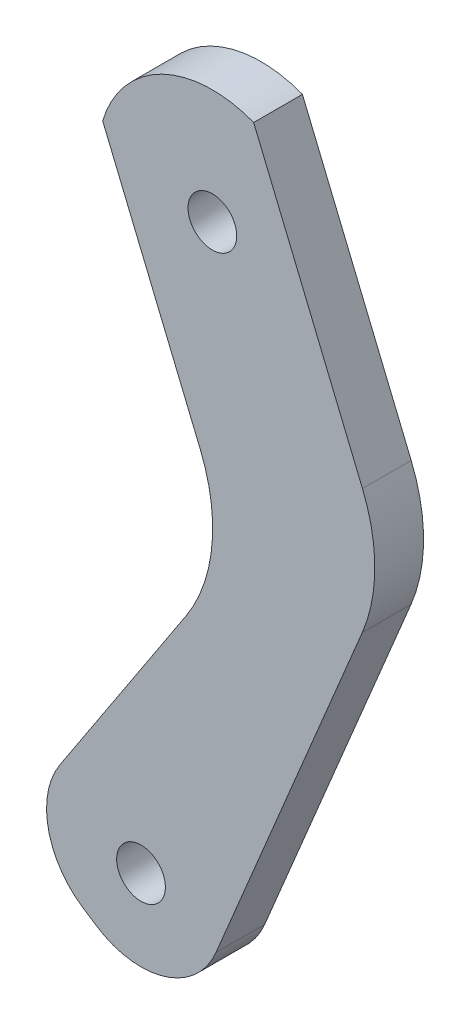
ISO-10303-21;
HEADER;
FILE_DESCRIPTION(('STEP AP214'),'2;1');
FILE_NAME('part.step','',(''),(''),'','','');
FILE_SCHEMA(('AUTOMOTIVE_DESIGN { 1 0 10303 214 1 1 1 1 }'));
ENDSEC;
DATA;
#1=APPLICATION_CONTEXT('core data for automotive mechanical design processes');
#2=APPLICATION_PROTOCOL_DEFINITION('international standard','automotive_design',2000,#1);
#3=PRODUCT_CONTEXT('',#1,'mechanical');
#4=PRODUCT('Part','Part','',(#3));
#5=PRODUCT_RELATED_PRODUCT_CATEGORY('part','',(#4));
#6=PRODUCT_DEFINITION_FORMATION('','',#4);
#7=PRODUCT_DEFINITION_CONTEXT('part definition',#1,'design');
#8=PRODUCT_DEFINITION('design','',#6,#7);
#9=PRODUCT_DEFINITION_SHAPE('','',#8);
#10=(LENGTH_UNIT() NAMED_UNIT(*) SI_UNIT(.MILLI.,.METRE.));
#11=(NAMED_UNIT(*) PLANE_ANGLE_UNIT() SI_UNIT($,.RADIAN.));
#12=(NAMED_UNIT(*) SI_UNIT($,.STERADIAN.) SOLID_ANGLE_UNIT());
#13=UNCERTAINTY_MEASURE_WITH_UNIT(LENGTH_MEASURE(1.E-05),#10,'distance_accuracy_value','');
#14=(GEOMETRIC_REPRESENTATION_CONTEXT(3) GLOBAL_UNCERTAINTY_ASSIGNED_CONTEXT((#13)) GLOBAL_UNIT_ASSIGNED_CONTEXT((#10,
#11,#12)) REPRESENTATION_CONTEXT('',''));
#15=CARTESIAN_POINT('',(0.,0.,0.));
#16=DIRECTION('',(0.,0.,1.));
#17=DIRECTION('',(1.,0.,0.));
#18=AXIS2_PLACEMENT_3D('',#15,#16,#17);
#19=CARTESIAN_POINT('',(0.,0.,30.));
#20=DIRECTION('',(0.,0.,1.));
#21=DIRECTION('',(1.,0.,0.));
#22=AXIS2_PLACEMENT_3D('',#19,#20,#21);
#23=PLANE('',#22);
#24=CARTESIAN_POINT('',(12.5109227187413,-76.9287521555556,30.));
#25=DIRECTION('',(0.,0.,1.));
#26=DIRECTION('',(1.,0.,0.));
#27=AXIS2_PLACEMENT_3D('',#24,#25,#26);
#28=CIRCLE('',#27,1.5);
#29=CARTESIAN_POINT('',(14.0109227187413,-76.9287521555556,30.));
#30=VERTEX_POINT('',#29);
#31=EDGE_CURVE('E166',#30,#30,#28,.T.);
#32=ORIENTED_EDGE('',*,*,#31,.F.);
#33=EDGE_LOOP('',(#32));
#34=FACE_BOUND('',#33,.T.);
#35=CARTESIAN_POINT('',(16.903408741352,-40.0174940368885,30.));
#36=DIRECTION('',(0.,0.,1.));
#37=DIRECTION('',(1.,0.,0.));
#38=AXIS2_PLACEMENT_3D('',#35,#36,#37);
#39=CIRCLE('',#38,1.5);
#40=CARTESIAN_POINT('',(18.403408741352,-40.0174940368885,30.));
#41=VERTEX_POINT('',#40);
#42=EDGE_CURVE('E162',#41,#41,#39,.T.);
#43=ORIENTED_EDGE('',*,*,#42,.F.);
#44=EDGE_LOOP('',(#43));
#45=FACE_BOUND('',#44,.T.);
#46=DIRECTION('',(0.382683432365094,-0.923879532511285,0.));
#47=VECTOR('',#46,1.);
#48=CARTESIAN_POINT('',(4.77297077300924,1.97702922699085,30.));
#49=LINE('',#48,#47);
#50=CARTESIAN_POINT('',(19.4456283635584,-33.445899724169,30.));
#51=VERTEX_POINT('',#50);
#52=CARTESIAN_POINT('',(26.1422040664648,-49.6128636075837,30.));
#53=VERTEX_POINT('',#52);
#54=EDGE_CURVE('E139',#51,#53,#49,.T.);
#55=ORIENTED_EDGE('',*,*,#54,.F.);
#56=CARTESIAN_POINT('',(16.903408741352,-40.0174940368885,30.));
#57=DIRECTION('',(0.,0.,1.));
#58=DIRECTION('',(1.,0.,0.));
#59=AXIS2_PLACEMENT_3D('',#56,#57,#58);
#60=CIRCLE('',#59,7.04618566449239);
#61=CARTESIAN_POINT('',(10.1505545040191,-38.0056063492099,30.));
#62=VERTEX_POINT('',#61);
#63=EDGE_CURVE('E55',#51,#62,#60,.T.);
#64=ORIENTED_EDGE('',*,*,#63,.T.);
#65=DIRECTION('',(0.382683432365094,-0.923879532511285,0.));
#66=VECTOR('',#65,1.);
#67=CARTESIAN_POINT('',(-4.77297077300924,-1.97702922699085,30.));
#68=LINE('',#67,#66);
#69=CARTESIAN_POINT('',(16.1615566872011,-52.5174493433021,30.));
#70=VERTEX_POINT('',#69);
#71=EDGE_CURVE('E196',#62,#70,#68,.T.);
#72=ORIENTED_EDGE('',*,*,#71,.T.);
#73=CARTESIAN_POINT('',(6.92276136208832,-56.3442836669531,30.));
#74=DIRECTION('',(0.,0.,1.));
#75=DIRECTION('',(1.,0.,0.));
#76=AXIS2_PLACEMENT_3D('',#73,#74,#75);
#77=CIRCLE('',#76,10.);
#78=CARTESIAN_POINT('',(15.280220873497,-61.8354466143773,30.));
#79=VERTEX_POINT('',#78);
#80=EDGE_CURVE('E199',#70,#79,#77,.F.);
#81=ORIENTED_EDGE('',*,*,#80,.T.);
#82=DIRECTION('',(-0.549116294742421,-0.835745951140868,0.));
#83=VECTOR('',#82,1.);
#84=CARTESIAN_POINT('',(39.0504251785727,-25.6575873959091,30.));
#85=LINE('',#84,#83);
#86=CARTESIAN_POINT('',(7.5185522467214,-73.6485783517402,30.));
#87=VERTEX_POINT('',#86);
#88=EDGE_CURVE('E171',#79,#87,#85,.T.);
#89=ORIENTED_EDGE('',*,*,#88,.T.);
#90=CARTESIAN_POINT('',(11.6972820024257,-76.3941598254523,30.));
#91=DIRECTION('',(0.,0.,1.));
#92=DIRECTION('',(1.,0.,0.));
#93=AXIS2_PLACEMENT_3D('',#90,#91,#92);
#94=CIRCLE('',#93,4.99999999999997);
#95=CARTESIAN_POINT('',(8.95170052871361,-80.5728895811567,30.));
#96=VERTEX_POINT('',#95);
#97=EDGE_CURVE('E175',#87,#96,#94,.T.);
#98=ORIENTED_EDGE('',*,*,#97,.T.);
#99=DIRECTION('',(0.835745951140868,-0.549116294742421,0.));
#100=VECTOR('',#99,1.);
#101=CARTESIAN_POINT('',(-34.2774544055634,-52.1697207115355,30.));
#102=LINE('',#101,#100);
#103=CARTESIAN_POINT('',(9.76534124502913,-81.1074819112599,30.));
#104=VERTEX_POINT('',#103);
#105=EDGE_CURVE('E179',#96,#104,#102,.T.);
#106=ORIENTED_EDGE('',*,*,#105,.T.);
#107=CARTESIAN_POINT('',(12.5109227187413,-76.9287521555556,30.));
#108=DIRECTION('',(0.,0.,1.));
#109=DIRECTION('',(1.,0.,0.));
#110=AXIS2_PLACEMENT_3D('',#107,#108,#109);
#111=CIRCLE('',#110,5.);
#112=CARTESIAN_POINT('',(17.1246309080053,-78.8558475720615,30.));
#113=VERTEX_POINT('',#112);
#114=EDGE_CURVE('E183',#104,#113,#111,.T.);
#115=ORIENTED_EDGE('',*,*,#114,.T.);
#116=DIRECTION('',(-0.385419083301175,-0.922741637852808,0.));
#117=VECTOR('',#116,1.);
#118=CARTESIAN_POINT('',(42.6252734327728,-17.8041102059186,30.));
#119=LINE('',#118,#117);
#120=CARTESIAN_POINT('',(26.1308251198801,-57.2938887642465,30.));
#121=VERTEX_POINT('',#120);
#122=EDGE_CURVE('E187',#121,#113,#119,.T.);
#123=ORIENTED_EDGE('',*,*,#122,.F.);
#124=CARTESIAN_POINT('',(16.903408741352,-53.4396979312347,30.));
#125=DIRECTION('',(0.,0.,1.));
#126=DIRECTION('',(1.,0.,0.));
#127=AXIS2_PLACEMENT_3D('',#124,#125,#126);
#128=CIRCLE('',#127,10.);
#129=EDGE_CURVE('E191',#121,#53,#128,.T.);
#130=ORIENTED_EDGE('',*,*,#129,.T.);
#131=EDGE_LOOP('',(#55,#64,#72,#81,#89,#98,#106,#115,#123,#130));
#132=FACE_BOUND('',#131,.T.);
#133=ADVANCED_FACE('F41',(#34,#45,#132),#23,.T.);
#134=CARTESIAN_POINT('',(-17.7714547427025,-30.,27.));
#135=DIRECTION('',(0.,0.,1.));
#136=DIRECTION('',(1.,0.,0.));
#137=AXIS2_PLACEMENT_3D('',#134,#135,#136);
#138=PLANE('',#137);
#139=CARTESIAN_POINT('',(12.5109227187413,-76.9287521555556,27.));
#140=DIRECTION('',(0.,0.,1.));
#141=DIRECTION('',(1.,0.,0.));
#142=AXIS2_PLACEMENT_3D('',#139,#140,#141);
#143=CIRCLE('',#142,1.5);
#144=CARTESIAN_POINT('',(14.0109227187413,-76.9287521555556,27.));
#145=VERTEX_POINT('',#144);
#146=EDGE_CURVE('E233',#145,#145,#143,.T.);
#147=ORIENTED_EDGE('',*,*,#146,.T.);
#148=EDGE_LOOP('',(#147));
#149=FACE_BOUND('',#148,.T.);
#150=CARTESIAN_POINT('',(16.903408741352,-40.0174940368885,27.));
#151=DIRECTION('',(0.,0.,1.));
#152=DIRECTION('',(1.,0.,0.));
#153=AXIS2_PLACEMENT_3D('',#150,#151,#152);
#154=CIRCLE('',#153,1.5);
#155=CARTESIAN_POINT('',(18.403408741352,-40.0174940368885,27.));
#156=VERTEX_POINT('',#155);
#157=EDGE_CURVE('E203',#156,#156,#154,.T.);
#158=ORIENTED_EDGE('',*,*,#157,.T.);
#159=EDGE_LOOP('',(#158));
#160=FACE_BOUND('',#159,.T.);
#161=CARTESIAN_POINT('',(16.903408741352,-40.0174940368885,27.));
#162=DIRECTION('',(0.,0.,1.));
#163=DIRECTION('',(1.,0.,0.));
#164=AXIS2_PLACEMENT_3D('',#161,#162,#163);
#165=CIRCLE('',#164,7.04618566449239);
#166=CARTESIAN_POINT('',(19.4456283635584,-33.445899724169,27.));
#167=VERTEX_POINT('',#166);
#168=CARTESIAN_POINT('',(10.1505545040191,-38.0056063492099,27.));
#169=VERTEX_POINT('',#168);
#170=EDGE_CURVE('E130',#167,#169,#165,.T.);
#171=ORIENTED_EDGE('',*,*,#170,.F.);
#172=DIRECTION('',(0.382683432365094,-0.923879532511285,0.));
#173=VECTOR('',#172,1.);
#174=CARTESIAN_POINT('',(4.77297077300924,1.97702922699085,27.));
#175=LINE('',#174,#173);
#176=CARTESIAN_POINT('',(26.1422040664648,-49.6128636075837,27.));
#177=VERTEX_POINT('',#176);
#178=EDGE_CURVE('E122',#167,#177,#175,.T.);
#179=ORIENTED_EDGE('',*,*,#178,.T.);
#180=CARTESIAN_POINT('',(16.903408741352,-53.4396979312347,27.));
#181=DIRECTION('',(0.,0.,1.));
#182=DIRECTION('',(1.,0.,0.));
#183=AXIS2_PLACEMENT_3D('',#180,#181,#182);
#184=CIRCLE('',#183,10.);
#185=CARTESIAN_POINT('',(26.1308251198801,-57.2938887642465,27.));
#186=VERTEX_POINT('',#185);
#187=EDGE_CURVE('E126',#186,#177,#184,.T.);
#188=ORIENTED_EDGE('',*,*,#187,.F.);
#189=DIRECTION('',(-0.385419083301175,-0.922741637852808,0.));
#190=VECTOR('',#189,1.);
#191=CARTESIAN_POINT('',(42.6252734327728,-17.8041102059186,27.));
#192=LINE('',#191,#190);
#193=CARTESIAN_POINT('',(17.1246309080053,-78.8558475720615,27.));
#194=VERTEX_POINT('',#193);
#195=EDGE_CURVE('E150',#186,#194,#192,.T.);
#196=ORIENTED_EDGE('',*,*,#195,.T.);
#197=CARTESIAN_POINT('',(12.5109227187413,-76.9287521555556,27.));
#198=DIRECTION('',(0.,0.,1.));
#199=DIRECTION('',(1.,0.,0.));
#200=AXIS2_PLACEMENT_3D('',#197,#198,#199);
#201=CIRCLE('',#200,5.);
#202=CARTESIAN_POINT('',(9.76534124502913,-81.1074819112599,27.));
#203=VERTEX_POINT('',#202);
#204=EDGE_CURVE('E153',#203,#194,#201,.T.);
#205=ORIENTED_EDGE('',*,*,#204,.F.);
#206=DIRECTION('',(0.835745951140868,-0.549116294742421,0.));
#207=VECTOR('',#206,1.);
#208=CARTESIAN_POINT('',(-34.2774544055634,-52.1697207115355,27.));
#209=LINE('',#208,#207);
#210=CARTESIAN_POINT('',(8.95170052871361,-80.5728895811567,27.));
#211=VERTEX_POINT('',#210);
#212=EDGE_CURVE('E237',#211,#203,#209,.T.);
#213=ORIENTED_EDGE('',*,*,#212,.F.);
#214=CARTESIAN_POINT('',(11.6972820024257,-76.3941598254523,27.));
#215=DIRECTION('',(0.,0.,1.));
#216=DIRECTION('',(1.,0.,0.));
#217=AXIS2_PLACEMENT_3D('',#214,#215,#216);
#218=CIRCLE('',#217,4.99999999999997);
#219=CARTESIAN_POINT('',(7.5185522467214,-73.6485783517402,27.));
#220=VERTEX_POINT('',#219);
#221=EDGE_CURVE('E231',#220,#211,#218,.T.);
#222=ORIENTED_EDGE('',*,*,#221,.F.);
#223=DIRECTION('',(-0.549116294742421,-0.835745951140868,0.));
#224=VECTOR('',#223,1.);
#225=CARTESIAN_POINT('',(39.0504251785727,-25.6575873959091,27.));
#226=LINE('',#225,#224);
#227=CARTESIAN_POINT('',(15.280220873497,-61.8354466143773,27.));
#228=VERTEX_POINT('',#227);
#229=EDGE_CURVE('E221',#228,#220,#226,.T.);
#230=ORIENTED_EDGE('',*,*,#229,.F.);
#231=CARTESIAN_POINT('',(6.92276136208832,-56.3442836669531,27.));
#232=DIRECTION('',(0.,0.,1.));
#233=DIRECTION('',(1.,0.,0.));
#234=AXIS2_PLACEMENT_3D('',#231,#232,#233);
#235=CIRCLE('',#234,10.);
#236=CARTESIAN_POINT('',(16.1615566872011,-52.5174493433021,27.));
#237=VERTEX_POINT('',#236);
#238=EDGE_CURVE('E159',#237,#228,#235,.F.);
#239=ORIENTED_EDGE('',*,*,#238,.F.);
#240=DIRECTION('',(0.382683432365094,-0.923879532511285,0.));
#241=VECTOR('',#240,1.);
#242=CARTESIAN_POINT('',(-4.77297077300924,-1.97702922699085,27.));
#243=LINE('',#242,#241);
#244=EDGE_CURVE('E133',#169,#237,#243,.T.);
#245=ORIENTED_EDGE('',*,*,#244,.F.);
#246=EDGE_LOOP('',(#171,#179,#188,#196,#205,#213,#222,#230,#239,#245));
#247=FACE_BOUND('',#246,.T.);
#248=ADVANCED_FACE('F124',(#149,#160,#247),#138,.F.);
#249=CARTESIAN_POINT('',(-4.77297077300924,-1.97702922699085,27.));
#250=DIRECTION('',(-0.923879532511285,-0.382683432365094,0.));
#251=DIRECTION('',(0.382683432365094,-0.923879532511285,0.));
#252=AXIS2_PLACEMENT_3D('',#249,#250,#251);
#253=PLANE('',#252);
#254=ORIENTED_EDGE('',*,*,#71,.F.);
#255=DIRECTION('',(0.,0.,1.));
#256=VECTOR('',#255,1.);
#257=CARTESIAN_POINT('',(10.1505545040191,-38.0056063492099,27.));
#258=LINE('',#257,#256);
#259=EDGE_CURVE('E167',#62,#169,#258,.F.);
#260=ORIENTED_EDGE('',*,*,#259,.T.);
#261=ORIENTED_EDGE('',*,*,#244,.T.);
#262=DIRECTION('',(0.,0.,1.));
#263=VECTOR('',#262,1.);
#264=CARTESIAN_POINT('',(16.1615566872011,-52.5174493433021,27.));
#265=LINE('',#264,#263);
#266=EDGE_CURVE('E144',#237,#70,#265,.T.);
#267=ORIENTED_EDGE('',*,*,#266,.T.);
#268=EDGE_LOOP('',(#254,#260,#261,#267));
#269=FACE_BOUND('',#268,.T.);
#270=ADVANCED_FACE('F271',(#269),#253,.T.);
#271=CARTESIAN_POINT('',(4.77297077300924,1.97702922699085,27.));
#272=DIRECTION('',(-0.923879532511285,-0.382683432365094,0.));
#273=DIRECTION('',(0.382683432365094,-0.923879532511285,0.));
#274=AXIS2_PLACEMENT_3D('',#271,#272,#273);
#275=PLANE('',#274);
#276=DIRECTION('',(0.,0.,1.));
#277=VECTOR('',#276,1.);
#278=CARTESIAN_POINT('',(19.4456283635584,-33.445899724169,27.));
#279=LINE('',#278,#277);
#280=EDGE_CURVE('E11',#51,#167,#279,.F.);
#281=ORIENTED_EDGE('',*,*,#280,.F.);
#282=ORIENTED_EDGE('',*,*,#54,.T.);
#283=DIRECTION('',(0.,0.,1.));
#284=VECTOR('',#283,1.);
#285=CARTESIAN_POINT('',(26.1422040664648,-49.6128636075837,27.));
#286=LINE('',#285,#284);
#287=EDGE_CURVE('E136',#177,#53,#286,.T.);
#288=ORIENTED_EDGE('',*,*,#287,.F.);
#289=ORIENTED_EDGE('',*,*,#178,.F.);
#290=EDGE_LOOP('',(#281,#282,#288,#289));
#291=FACE_BOUND('',#290,.T.);
#292=ADVANCED_FACE('F137',(#291),#275,.F.);
#293=CARTESIAN_POINT('',(39.0504251785727,-25.6575873959091,27.));
#294=DIRECTION('',(-0.835745951140868,0.549116294742421,0.));
#295=DIRECTION('',(-0.549116294742421,-0.835745951140868,0.));
#296=AXIS2_PLACEMENT_3D('',#293,#294,#295);
#297=PLANE('',#296);
#298=ORIENTED_EDGE('',*,*,#88,.F.);
#299=DIRECTION('',(0.,0.,1.));
#300=VECTOR('',#299,1.);
#301=CARTESIAN_POINT('',(15.280220873497,-61.8354466143773,27.));
#302=LINE('',#301,#300);
#303=EDGE_CURVE('E49',#228,#79,#302,.T.);
#304=ORIENTED_EDGE('',*,*,#303,.F.);
#305=ORIENTED_EDGE('',*,*,#229,.T.);
#306=DIRECTION('',(0.,0.,1.));
#307=VECTOR('',#306,1.);
#308=CARTESIAN_POINT('',(7.5185522467214,-73.6485783517402,27.));
#309=LINE('',#308,#307);
#310=EDGE_CURVE('E102',#220,#87,#309,.T.);
#311=ORIENTED_EDGE('',*,*,#310,.T.);
#312=EDGE_LOOP('',(#298,#304,#305,#311));
#313=FACE_BOUND('',#312,.T.);
#314=ADVANCED_FACE('F220',(#313),#297,.T.);
#315=CARTESIAN_POINT('',(6.92276136208832,-56.3442836669531,27.));
#316=DIRECTION('',(0.,0.,1.));
#317=DIRECTION('',(1.,0.,0.));
#318=AXIS2_PLACEMENT_3D('',#315,#316,#317);
#319=CYLINDRICAL_SURFACE('',#318,10.);
#320=ORIENTED_EDGE('',*,*,#80,.F.);
#321=ORIENTED_EDGE('',*,*,#266,.F.);
#322=ORIENTED_EDGE('',*,*,#238,.T.);
#323=ORIENTED_EDGE('',*,*,#303,.T.);
#324=EDGE_LOOP('',(#320,#321,#322,#323));
#325=FACE_BOUND('',#324,.T.);
#326=ADVANCED_FACE('F227',(#325),#319,.F.);
#327=CARTESIAN_POINT('',(16.903408741352,-53.4396979312347,27.));
#328=DIRECTION('',(0.,0.,1.));
#329=DIRECTION('',(1.,0.,0.));
#330=AXIS2_PLACEMENT_3D('',#327,#328,#329);
#331=CYLINDRICAL_SURFACE('',#330,10.);
#332=ORIENTED_EDGE('',*,*,#129,.F.);
#333=DIRECTION('',(0.,0.,1.));
#334=VECTOR('',#333,1.);
#335=CARTESIAN_POINT('',(26.1308251198801,-57.2938887642465,27.));
#336=LINE('',#335,#334);
#337=EDGE_CURVE('E145',#186,#121,#336,.T.);
#338=ORIENTED_EDGE('',*,*,#337,.F.);
#339=ORIENTED_EDGE('',*,*,#187,.T.);
#340=ORIENTED_EDGE('',*,*,#287,.T.);
#341=EDGE_LOOP('',(#332,#338,#339,#340));
#342=FACE_BOUND('',#341,.T.);
#343=ADVANCED_FACE('F147',(#342),#331,.T.);
#344=CARTESIAN_POINT('',(42.6252734327728,-17.8041102059186,27.));
#345=DIRECTION('',(-0.922741637852808,0.385419083301175,0.));
#346=DIRECTION('',(-0.385419083301175,-0.922741637852808,0.));
#347=AXIS2_PLACEMENT_3D('',#344,#345,#346);
#348=PLANE('',#347);
#349=ORIENTED_EDGE('',*,*,#122,.T.);
#350=DIRECTION('',(0.,0.,1.));
#351=VECTOR('',#350,1.);
#352=CARTESIAN_POINT('',(17.1246309080053,-78.8558475720615,27.));
#353=LINE('',#352,#351);
#354=EDGE_CURVE('E211',#194,#113,#353,.T.);
#355=ORIENTED_EDGE('',*,*,#354,.F.);
#356=ORIENTED_EDGE('',*,*,#195,.F.);
#357=ORIENTED_EDGE('',*,*,#337,.T.);
#358=EDGE_LOOP('',(#349,#355,#356,#357));
#359=FACE_BOUND('',#358,.T.);
#360=ADVANCED_FACE('F256',(#359),#348,.F.);
#361=CARTESIAN_POINT('',(12.5109227187413,-76.9287521555556,27.));
#362=DIRECTION('',(0.,0.,1.));
#363=DIRECTION('',(1.,0.,0.));
#364=AXIS2_PLACEMENT_3D('',#361,#362,#363);
#365=CYLINDRICAL_SURFACE('',#364,5.);
#366=ORIENTED_EDGE('',*,*,#114,.F.);
#367=DIRECTION('',(0.,0.,1.));
#368=VECTOR('',#367,1.);
#369=CARTESIAN_POINT('',(9.76534124502913,-81.1074819112599,27.));
#370=LINE('',#369,#368);
#371=EDGE_CURVE('E214',#203,#104,#370,.T.);
#372=ORIENTED_EDGE('',*,*,#371,.F.);
#373=ORIENTED_EDGE('',*,*,#204,.T.);
#374=ORIENTED_EDGE('',*,*,#354,.T.);
#375=EDGE_LOOP('',(#366,#372,#373,#374));
#376=FACE_BOUND('',#375,.T.);
#377=ADVANCED_FACE('F250',(#376),#365,.T.);
#378=CARTESIAN_POINT('',(-34.2774544055634,-52.1697207115355,27.));
#379=DIRECTION('',(-0.549116294742421,-0.835745951140868,0.));
#380=DIRECTION('',(0.835745951140868,-0.549116294742421,0.));
#381=AXIS2_PLACEMENT_3D('',#378,#379,#380);
#382=PLANE('',#381);
#383=ORIENTED_EDGE('',*,*,#105,.F.);
#384=DIRECTION('',(0.,0.,1.));
#385=VECTOR('',#384,1.);
#386=CARTESIAN_POINT('',(8.95170052871361,-80.5728895811567,27.));
#387=LINE('',#386,#385);
#388=EDGE_CURVE('E217',#211,#96,#387,.T.);
#389=ORIENTED_EDGE('',*,*,#388,.F.);
#390=ORIENTED_EDGE('',*,*,#212,.T.);
#391=ORIENTED_EDGE('',*,*,#371,.T.);
#392=EDGE_LOOP('',(#383,#389,#390,#391));
#393=FACE_BOUND('',#392,.T.);
#394=ADVANCED_FACE('F253',(#393),#382,.T.);
#395=CARTESIAN_POINT('',(12.5109227187413,-76.9287521555556,27.));
#396=DIRECTION('',(0.,0.,1.));
#397=DIRECTION('',(1.,0.,0.));
#398=AXIS2_PLACEMENT_3D('',#395,#396,#397);
#399=CYLINDRICAL_SURFACE('',#398,1.5);
#400=ORIENTED_EDGE('',*,*,#146,.F.);
#401=EDGE_LOOP('',(#400));
#402=FACE_BOUND('',#401,.T.);
#403=ORIENTED_EDGE('',*,*,#31,.T.);
#404=EDGE_LOOP('',(#403));
#405=FACE_BOUND('',#404,.T.);
#406=ADVANCED_FACE('F279',(#402,#405),#399,.F.);
#407=CARTESIAN_POINT('',(16.903408741352,-40.0174940368885,27.));
#408=DIRECTION('',(0.,0.,1.));
#409=DIRECTION('',(1.,0.,0.));
#410=AXIS2_PLACEMENT_3D('',#407,#408,#409);
#411=CYLINDRICAL_SURFACE('',#410,1.5);
#412=ORIENTED_EDGE('',*,*,#157,.F.);
#413=EDGE_LOOP('',(#412));
#414=FACE_BOUND('',#413,.T.);
#415=ORIENTED_EDGE('',*,*,#42,.T.);
#416=EDGE_LOOP('',(#415));
#417=FACE_BOUND('',#416,.T.);
#418=ADVANCED_FACE('F277',(#414,#417),#411,.F.);
#419=CARTESIAN_POINT('',(11.6972820024257,-76.3941598254523,27.));
#420=DIRECTION('',(0.,0.,1.));
#421=DIRECTION('',(1.,0.,0.));
#422=AXIS2_PLACEMENT_3D('',#419,#420,#421);
#423=CYLINDRICAL_SURFACE('',#422,4.99999999999997);
#424=ORIENTED_EDGE('',*,*,#97,.F.);
#425=ORIENTED_EDGE('',*,*,#310,.F.);
#426=ORIENTED_EDGE('',*,*,#221,.T.);
#427=ORIENTED_EDGE('',*,*,#388,.T.);
#428=EDGE_LOOP('',(#424,#425,#426,#427));
#429=FACE_BOUND('',#428,.T.);
#430=ADVANCED_FACE('F222',(#429),#423,.T.);
#431=CARTESIAN_POINT('',(16.903408741352,-40.0174940368885,27.));
#432=DIRECTION('',(0.,0.,1.));
#433=DIRECTION('',(1.,0.,0.));
#434=AXIS2_PLACEMENT_3D('',#431,#432,#433);
#435=CYLINDRICAL_SURFACE('',#434,7.04618566449239);
#436=ORIENTED_EDGE('',*,*,#63,.F.);
#437=ORIENTED_EDGE('',*,*,#280,.T.);
#438=ORIENTED_EDGE('',*,*,#170,.T.);
#439=ORIENTED_EDGE('',*,*,#259,.F.);
#440=EDGE_LOOP('',(#436,#437,#438,#439));
#441=FACE_BOUND('',#440,.T.);
#442=ADVANCED_FACE('F286',(#441),#435,.T.);
#443=CLOSED_SHELL('',(#133,#248,#270,#292,#314,#326,#343,#360,#377,#394,#406,#418,#430,#442));
#444=MANIFOLD_SOLID_BREP('B2',#443);
#445=ADVANCED_BREP_SHAPE_REPRESENTATION('',(#18,#444),#14);
#446=SHAPE_DEFINITION_REPRESENTATION(#9,#445);
ENDSEC;
END-ISO-10303-21;
